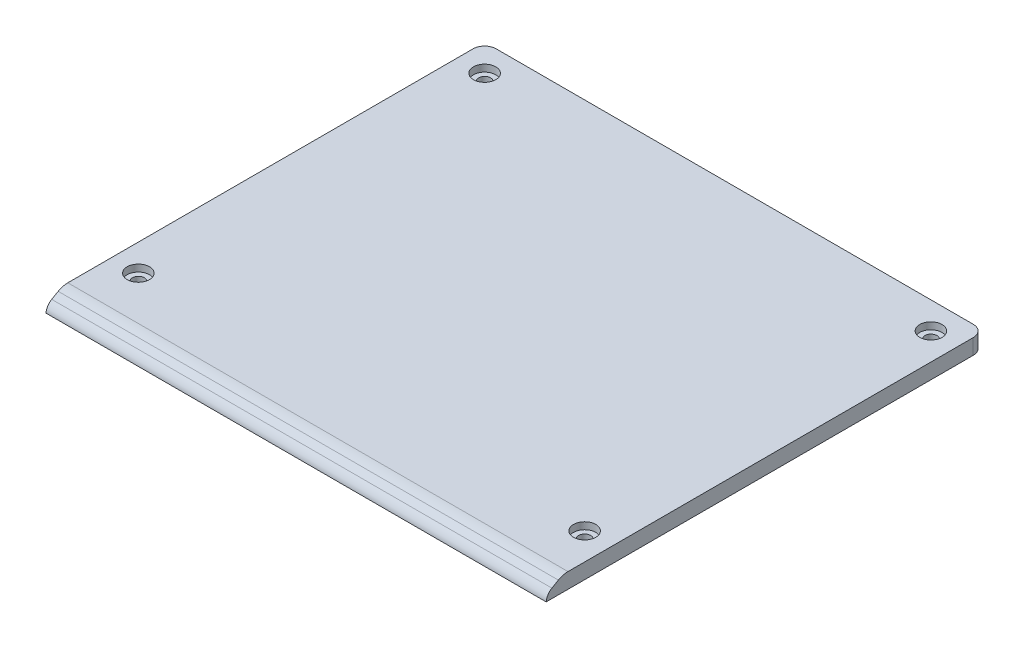
ISO-10303-21;
HEADER;
FILE_DESCRIPTION(('STEP AP214'),'2;1');
FILE_NAME('part.step','',(''),(''),'','','');
FILE_SCHEMA(('AUTOMOTIVE_DESIGN { 1 0 10303 214 1 1 1 1 }'));
ENDSEC;
DATA;
#1=APPLICATION_CONTEXT('core data for automotive mechanical design processes');
#2=APPLICATION_PROTOCOL_DEFINITION('international standard','automotive_design',2000,#1);
#3=PRODUCT_CONTEXT('',#1,'mechanical');
#4=PRODUCT('Part','Part','',(#3));
#5=PRODUCT_RELATED_PRODUCT_CATEGORY('part','',(#4));
#6=PRODUCT_DEFINITION_FORMATION('','',#4);
#7=PRODUCT_DEFINITION_CONTEXT('part definition',#1,'design');
#8=PRODUCT_DEFINITION('design','',#6,#7);
#9=PRODUCT_DEFINITION_SHAPE('','',#8);
#10=(LENGTH_UNIT() NAMED_UNIT(*) SI_UNIT(.MILLI.,.METRE.));
#11=(NAMED_UNIT(*) PLANE_ANGLE_UNIT() SI_UNIT($,.RADIAN.));
#12=(NAMED_UNIT(*) SI_UNIT($,.STERADIAN.) SOLID_ANGLE_UNIT());
#13=UNCERTAINTY_MEASURE_WITH_UNIT(LENGTH_MEASURE(1.E-05),#10,'distance_accuracy_value','');
#14=(GEOMETRIC_REPRESENTATION_CONTEXT(3) GLOBAL_UNCERTAINTY_ASSIGNED_CONTEXT((#13)) GLOBAL_UNIT_ASSIGNED_CONTEXT((#10,
#11,#12)) REPRESENTATION_CONTEXT('',''));
#15=CARTESIAN_POINT('',(0.,0.,0.));
#16=DIRECTION('',(0.,0.,1.));
#17=DIRECTION('',(1.,0.,0.));
#18=AXIS2_PLACEMENT_3D('',#15,#16,#17);
#19=CARTESIAN_POINT('',(58.,0.,40.));
#20=DIRECTION('',(0.,1.,0.));
#21=DIRECTION('',(0.,0.,1.));
#22=AXIS2_PLACEMENT_3D('',#19,#20,#21);
#23=CYLINDRICAL_SURFACE('',#22,1.55);
#24=CARTESIAN_POINT('',(58.,0.,40.));
#25=DIRECTION('',(0.,1.,0.));
#26=DIRECTION('',(0.,0.,1.));
#27=AXIS2_PLACEMENT_3D('',#24,#25,#26);
#28=CIRCLE('',#27,1.55);
#29=CARTESIAN_POINT('',(58.,0.,41.55));
#30=VERTEX_POINT('',#29);
#31=EDGE_CURVE('E11',#30,#30,#28,.T.);
#32=ORIENTED_EDGE('',*,*,#31,.F.);
#33=EDGE_LOOP('',(#32));
#34=FACE_BOUND('',#33,.T.);
#35=CARTESIAN_POINT('',(58.,2.2,40.));
#36=DIRECTION('',(0.,1.,0.));
#37=DIRECTION('',(0.,0.,1.));
#38=AXIS2_PLACEMENT_3D('',#35,#36,#37);
#39=CIRCLE('',#38,1.55);
#40=CARTESIAN_POINT('',(58.,2.2,41.55));
#41=VERTEX_POINT('',#40);
#42=EDGE_CURVE('E45',#41,#41,#39,.F.);
#43=ORIENTED_EDGE('',*,*,#42,.F.);
#44=EDGE_LOOP('',(#43));
#45=FACE_BOUND('',#44,.T.);
#46=ADVANCED_FACE('F42',(#34,#45),#23,.F.);
#47=CARTESIAN_POINT('',(-58.,0.,40.));
#48=DIRECTION('',(0.,1.,0.));
#49=DIRECTION('',(0.,0.,1.));
#50=AXIS2_PLACEMENT_3D('',#47,#48,#49);
#51=CYLINDRICAL_SURFACE('',#50,1.55);
#52=CARTESIAN_POINT('',(-58.,0.,40.));
#53=DIRECTION('',(0.,1.,0.));
#54=DIRECTION('',(0.,0.,1.));
#55=AXIS2_PLACEMENT_3D('',#52,#53,#54);
#56=CIRCLE('',#55,1.55);
#57=CARTESIAN_POINT('',(-58.,0.,41.55));
#58=VERTEX_POINT('',#57);
#59=EDGE_CURVE('E51',#58,#58,#56,.T.);
#60=ORIENTED_EDGE('',*,*,#59,.F.);
#61=EDGE_LOOP('',(#60));
#62=FACE_BOUND('',#61,.T.);
#63=CARTESIAN_POINT('',(-58.,2.2,40.));
#64=DIRECTION('',(0.,1.,0.));
#65=DIRECTION('',(0.,0.,1.));
#66=AXIS2_PLACEMENT_3D('',#63,#64,#65);
#67=CIRCLE('',#66,1.55);
#68=CARTESIAN_POINT('',(-58.,2.2,41.55));
#69=VERTEX_POINT('',#68);
#70=EDGE_CURVE('E209',#69,#69,#67,.F.);
#71=ORIENTED_EDGE('',*,*,#70,.F.);
#72=EDGE_LOOP('',(#71));
#73=FACE_BOUND('',#72,.T.);
#74=ADVANCED_FACE('F272',(#62,#73),#51,.F.);
#75=CARTESIAN_POINT('',(58.,0.,-50.));
#76=DIRECTION('',(0.,1.,0.));
#77=DIRECTION('',(0.,0.,1.));
#78=AXIS2_PLACEMENT_3D('',#75,#76,#77);
#79=CYLINDRICAL_SURFACE('',#78,1.55);
#80=CARTESIAN_POINT('',(58.,0.,-50.));
#81=DIRECTION('',(0.,1.,0.));
#82=DIRECTION('',(0.,0.,1.));
#83=AXIS2_PLACEMENT_3D('',#80,#81,#82);
#84=CIRCLE('',#83,1.55);
#85=CARTESIAN_POINT('',(58.,0.,-48.45));
#86=VERTEX_POINT('',#85);
#87=EDGE_CURVE('E204',#86,#86,#84,.T.);
#88=ORIENTED_EDGE('',*,*,#87,.F.);
#89=EDGE_LOOP('',(#88));
#90=FACE_BOUND('',#89,.T.);
#91=CARTESIAN_POINT('',(58.,2.2,-50.));
#92=DIRECTION('',(0.,1.,0.));
#93=DIRECTION('',(0.,0.,1.));
#94=AXIS2_PLACEMENT_3D('',#91,#92,#93);
#95=CIRCLE('',#94,1.55);
#96=CARTESIAN_POINT('',(58.,2.2,-48.45));
#97=VERTEX_POINT('',#96);
#98=EDGE_CURVE('E206',#97,#97,#95,.F.);
#99=ORIENTED_EDGE('',*,*,#98,.F.);
#100=EDGE_LOOP('',(#99));
#101=FACE_BOUND('',#100,.T.);
#102=ADVANCED_FACE('F277',(#90,#101),#79,.F.);
#103=CARTESIAN_POINT('',(-58.,0.,-50.));
#104=DIRECTION('',(0.,1.,0.));
#105=DIRECTION('',(0.,0.,1.));
#106=AXIS2_PLACEMENT_3D('',#103,#104,#105);
#107=CYLINDRICAL_SURFACE('',#106,1.55);
#108=CARTESIAN_POINT('',(-58.,0.,-50.));
#109=DIRECTION('',(0.,1.,0.));
#110=DIRECTION('',(0.,0.,1.));
#111=AXIS2_PLACEMENT_3D('',#108,#109,#110);
#112=CIRCLE('',#111,1.55);
#113=CARTESIAN_POINT('',(-58.,0.,-48.45));
#114=VERTEX_POINT('',#113);
#115=EDGE_CURVE('E233',#114,#114,#112,.T.);
#116=ORIENTED_EDGE('',*,*,#115,.F.);
#117=EDGE_LOOP('',(#116));
#118=FACE_BOUND('',#117,.T.);
#119=CARTESIAN_POINT('',(-58.,2.2,-50.));
#120=DIRECTION('',(0.,1.,0.));
#121=DIRECTION('',(0.,0.,1.));
#122=AXIS2_PLACEMENT_3D('',#119,#120,#121);
#123=CIRCLE('',#122,1.55);
#124=CARTESIAN_POINT('',(-58.,2.2,-48.45));
#125=VERTEX_POINT('',#124);
#126=EDGE_CURVE('E200',#125,#125,#123,.F.);
#127=ORIENTED_EDGE('',*,*,#126,.F.);
#128=EDGE_LOOP('',(#127));
#129=FACE_BOUND('',#128,.T.);
#130=ADVANCED_FACE('F285',(#118,#129),#107,.F.);
#131=CARTESIAN_POINT('',(65.,4.,-57.));
#132=DIRECTION('',(-1.,0.,0.));
#133=DIRECTION('',(0.,0.,1.));
#134=AXIS2_PLACEMENT_3D('',#131,#132,#133);
#135=PLANE('',#134);
#136=DIRECTION('',(0.,0.,-1.));
#137=VECTOR('',#136,1.);
#138=CARTESIAN_POINT('',(65.,0.,-57.));
#139=LINE('',#138,#137);
#140=CARTESIAN_POINT('',(65.,0.,57.));
#141=VERTEX_POINT('',#140);
#142=CARTESIAN_POINT('',(65.,0.,-54.));
#143=VERTEX_POINT('',#142);
#144=EDGE_CURVE('E139',#141,#143,#139,.T.);
#145=ORIENTED_EDGE('',*,*,#144,.T.);
#146=DIRECTION('',(0.,-1.,0.));
#147=VECTOR('',#146,1.);
#148=CARTESIAN_POINT('',(65.,4.,-54.));
#149=LINE('',#148,#147);
#150=CARTESIAN_POINT('',(65.,4.,-54.));
#151=VERTEX_POINT('',#150);
#152=EDGE_CURVE('E59',#143,#151,#149,.F.);
#153=ORIENTED_EDGE('',*,*,#152,.T.);
#154=DIRECTION('',(0.,0.,-1.));
#155=VECTOR('',#154,1.);
#156=CARTESIAN_POINT('',(65.,4.,-57.));
#157=LINE('',#156,#155);
#158=CARTESIAN_POINT('',(65.,4.,51.3301270189221));
#159=VERTEX_POINT('',#158);
#160=EDGE_CURVE('E141',#159,#151,#157,.T.);
#161=ORIENTED_EDGE('',*,*,#160,.F.);
#162=CARTESIAN_POINT('',(65.,-1.,51.3301270189222));
#163=DIRECTION('',(-1.,0.,0.));
#164=DIRECTION('',(0.,0.,1.));
#165=AXIS2_PLACEMENT_3D('',#162,#163,#164);
#166=CIRCLE('',#165,5.);
#167=CARTESIAN_POINT('',(65.,3.3301270189222,53.8301270189222));
#168=VERTEX_POINT('',#167);
#169=EDGE_CURVE('E160',#159,#168,#166,.F.);
#170=ORIENTED_EDGE('',*,*,#169,.T.);
#171=DIRECTION('',(0.,-0.499999999999999,0.866025403784439));
#172=VECTOR('',#171,1.);
#173=CARTESIAN_POINT('',(65.,4.00000000000001,52.6698729810778));
#174=LINE('',#173,#172);
#175=CARTESIAN_POINT('',(65.,2.36058980188207,55.5094147386646));
#176=VERTEX_POINT('',#175);
#177=EDGE_CURVE('E148',#168,#176,#174,.T.);
#178=ORIENTED_EDGE('',*,*,#177,.T.);
#179=CARTESIAN_POINT('',(65.,-0.237486409471245,54.0094147386646));
#180=DIRECTION('',(-1.,0.,0.));
#181=DIRECTION('',(0.,0.,1.));
#182=AXIS2_PLACEMENT_3D('',#179,#180,#181);
#183=CIRCLE('',#182,3.);
#184=EDGE_CURVE('E172',#176,#141,#183,.F.);
#185=ORIENTED_EDGE('',*,*,#184,.T.);
#186=EDGE_LOOP('',(#145,#153,#161,#170,#178,#185));
#187=FACE_BOUND('',#186,.T.);
#188=ADVANCED_FACE('F257',(#187),#135,.F.);
#189=CARTESIAN_POINT('',(-65.,4.,-57.));
#190=DIRECTION('',(0.,0.,1.));
#191=DIRECTION('',(1.,0.,0.));
#192=AXIS2_PLACEMENT_3D('',#189,#190,#191);
#193=PLANE('',#192);
#194=DIRECTION('',(-1.,0.,0.));
#195=VECTOR('',#194,1.);
#196=CARTESIAN_POINT('',(-65.,0.,-57.));
#197=LINE('',#196,#195);
#198=CARTESIAN_POINT('',(62.,0.,-57.));
#199=VERTEX_POINT('',#198);
#200=CARTESIAN_POINT('',(-62.,0.,-57.));
#201=VERTEX_POINT('',#200);
#202=EDGE_CURVE('E125',#199,#201,#197,.T.);
#203=ORIENTED_EDGE('',*,*,#202,.T.);
#204=DIRECTION('',(0.,-1.,0.));
#205=VECTOR('',#204,1.);
#206=CARTESIAN_POINT('',(-62.,4.,-57.));
#207=LINE('',#206,#205);
#208=CARTESIAN_POINT('',(-62.,4.,-57.));
#209=VERTEX_POINT('',#208);
#210=EDGE_CURVE('E67',#201,#209,#207,.F.);
#211=ORIENTED_EDGE('',*,*,#210,.T.);
#212=DIRECTION('',(-1.,0.,0.));
#213=VECTOR('',#212,1.);
#214=CARTESIAN_POINT('',(-65.,4.,-57.));
#215=LINE('',#214,#213);
#216=CARTESIAN_POINT('',(62.,4.,-57.));
#217=VERTEX_POINT('',#216);
#218=EDGE_CURVE('E144',#217,#209,#215,.T.);
#219=ORIENTED_EDGE('',*,*,#218,.F.);
#220=DIRECTION('',(0.,-1.,0.));
#221=VECTOR('',#220,1.);
#222=CARTESIAN_POINT('',(62.,4.,-57.));
#223=LINE('',#222,#221);
#224=EDGE_CURVE('E183',#217,#199,#223,.T.);
#225=ORIENTED_EDGE('',*,*,#224,.T.);
#226=EDGE_LOOP('',(#203,#211,#219,#225));
#227=FACE_BOUND('',#226,.T.);
#228=ADVANCED_FACE('F244',(#227),#193,.F.);
#229=CARTESIAN_POINT('',(-65.,4.,-57.));
#230=DIRECTION('',(1.,0.,0.));
#231=DIRECTION('',(0.,0.,-1.));
#232=AXIS2_PLACEMENT_3D('',#229,#230,#231);
#233=PLANE('',#232);
#234=DIRECTION('',(0.,0.,1.));
#235=VECTOR('',#234,1.);
#236=CARTESIAN_POINT('',(-65.,4.,-57.));
#237=LINE('',#236,#235);
#238=CARTESIAN_POINT('',(-65.,4.,-54.));
#239=VERTEX_POINT('',#238);
#240=CARTESIAN_POINT('',(-65.,4.,51.3301270189221));
#241=VERTEX_POINT('',#240);
#242=EDGE_CURVE('E153',#239,#241,#237,.T.);
#243=ORIENTED_EDGE('',*,*,#242,.F.);
#244=DIRECTION('',(0.,-1.,0.));
#245=VECTOR('',#244,1.);
#246=CARTESIAN_POINT('',(-65.,4.,-54.));
#247=LINE('',#246,#245);
#248=CARTESIAN_POINT('',(-65.,0.,-54.));
#249=VERTEX_POINT('',#248);
#250=EDGE_CURVE('E120',#239,#249,#247,.T.);
#251=ORIENTED_EDGE('',*,*,#250,.T.);
#252=DIRECTION('',(0.,0.,1.));
#253=VECTOR('',#252,1.);
#254=CARTESIAN_POINT('',(-65.,0.,-57.));
#255=LINE('',#254,#253);
#256=CARTESIAN_POINT('',(-65.,0.,57.));
#257=VERTEX_POINT('',#256);
#258=EDGE_CURVE('E113',#249,#257,#255,.T.);
#259=ORIENTED_EDGE('',*,*,#258,.T.);
#260=CARTESIAN_POINT('',(-65.,-0.237486409471245,54.0094147386646));
#261=DIRECTION('',(1.,0.,0.));
#262=DIRECTION('',(0.,0.,-1.));
#263=AXIS2_PLACEMENT_3D('',#260,#261,#262);
#264=CIRCLE('',#263,3.);
#265=CARTESIAN_POINT('',(-65.,2.36058980188207,55.5094147386646));
#266=VERTEX_POINT('',#265);
#267=EDGE_CURVE('E117',#257,#266,#264,.F.);
#268=ORIENTED_EDGE('',*,*,#267,.T.);
#269=DIRECTION('',(0.,0.499999999999999,-0.866025403784439));
#270=VECTOR('',#269,1.);
#271=CARTESIAN_POINT('',(-65.,4.,52.6698729810778));
#272=LINE('',#271,#270);
#273=CARTESIAN_POINT('',(-65.,3.3301270189222,53.8301270189222));
#274=VERTEX_POINT('',#273);
#275=EDGE_CURVE('E152',#266,#274,#272,.T.);
#276=ORIENTED_EDGE('',*,*,#275,.T.);
#277=CARTESIAN_POINT('',(-65.,-1.,51.3301270189222));
#278=DIRECTION('',(1.,0.,0.));
#279=DIRECTION('',(0.,0.,-1.));
#280=AXIS2_PLACEMENT_3D('',#277,#278,#279);
#281=CIRCLE('',#280,5.);
#282=EDGE_CURVE('E134',#274,#241,#281,.F.);
#283=ORIENTED_EDGE('',*,*,#282,.T.);
#284=EDGE_LOOP('',(#243,#251,#259,#268,#276,#283));
#285=FACE_BOUND('',#284,.T.);
#286=ADVANCED_FACE('F116',(#285),#233,.F.);
#287=CARTESIAN_POINT('',(0.,4.,0.));
#288=DIRECTION('',(0.,1.,0.));
#289=DIRECTION('',(0.,0.,1.));
#290=AXIS2_PLACEMENT_3D('',#287,#288,#289);
#291=PLANE('',#290);
#292=CARTESIAN_POINT('',(-58.,4.,40.));
#293=DIRECTION('',(0.,1.,0.));
#294=DIRECTION('',(0.,0.,1.));
#295=AXIS2_PLACEMENT_3D('',#292,#293,#294);
#296=CIRCLE('',#295,2.9);
#297=CARTESIAN_POINT('',(-58.,4.,42.9));
#298=VERTEX_POINT('',#297);
#299=EDGE_CURVE('E471',#298,#298,#296,.T.);
#300=ORIENTED_EDGE('',*,*,#299,.F.);
#301=EDGE_LOOP('',(#300));
#302=FACE_BOUND('',#301,.T.);
#303=CARTESIAN_POINT('',(58.,4.,-50.));
#304=DIRECTION('',(0.,1.,0.));
#305=DIRECTION('',(0.,0.,1.));
#306=AXIS2_PLACEMENT_3D('',#303,#304,#305);
#307=CIRCLE('',#306,2.9);
#308=CARTESIAN_POINT('',(58.,4.,-47.1));
#309=VERTEX_POINT('',#308);
#310=EDGE_CURVE('E475',#309,#309,#307,.T.);
#311=ORIENTED_EDGE('',*,*,#310,.F.);
#312=EDGE_LOOP('',(#311));
#313=FACE_BOUND('',#312,.T.);
#314=CARTESIAN_POINT('',(58.,4.,40.));
#315=DIRECTION('',(0.,1.,0.));
#316=DIRECTION('',(0.,0.,1.));
#317=AXIS2_PLACEMENT_3D('',#314,#315,#316);
#318=CIRCLE('',#317,2.9);
#319=CARTESIAN_POINT('',(58.,4.,42.9));
#320=VERTEX_POINT('',#319);
#321=EDGE_CURVE('E479',#320,#320,#318,.T.);
#322=ORIENTED_EDGE('',*,*,#321,.F.);
#323=EDGE_LOOP('',(#322));
#324=FACE_BOUND('',#323,.T.);
#325=CARTESIAN_POINT('',(-58.,4.,-50.));
#326=DIRECTION('',(0.,1.,0.));
#327=DIRECTION('',(0.,0.,1.));
#328=AXIS2_PLACEMENT_3D('',#325,#326,#327);
#329=CIRCLE('',#328,2.9);
#330=CARTESIAN_POINT('',(-58.,4.,-47.1));
#331=VERTEX_POINT('',#330);
#332=EDGE_CURVE('E217',#331,#331,#329,.T.);
#333=ORIENTED_EDGE('',*,*,#332,.F.);
#334=EDGE_LOOP('',(#333));
#335=FACE_BOUND('',#334,.T.);
#336=ORIENTED_EDGE('',*,*,#218,.T.);
#337=CARTESIAN_POINT('',(-62.,4.,-54.));
#338=DIRECTION('',(0.,1.,0.));
#339=DIRECTION('',(0.,0.,1.));
#340=AXIS2_PLACEMENT_3D('',#337,#338,#339);
#341=CIRCLE('',#340,3.);
#342=EDGE_CURVE('E192',#209,#239,#341,.T.);
#343=ORIENTED_EDGE('',*,*,#342,.T.);
#344=ORIENTED_EDGE('',*,*,#242,.T.);
#345=DIRECTION('',(1.,0.,0.));
#346=VECTOR('',#345,1.);
#347=CARTESIAN_POINT('',(0.,4.,51.3301270189222));
#348=LINE('',#347,#346);
#349=EDGE_CURVE('E156',#241,#159,#348,.T.);
#350=ORIENTED_EDGE('',*,*,#349,.T.);
#351=ORIENTED_EDGE('',*,*,#160,.T.);
#352=CARTESIAN_POINT('',(62.,4.,-54.));
#353=DIRECTION('',(0.,1.,0.));
#354=DIRECTION('',(0.,0.,1.));
#355=AXIS2_PLACEMENT_3D('',#352,#353,#354);
#356=CIRCLE('',#355,3.);
#357=EDGE_CURVE('E189',#151,#217,#356,.T.);
#358=ORIENTED_EDGE('',*,*,#357,.T.);
#359=EDGE_LOOP('',(#336,#343,#344,#350,#351,#358));
#360=FACE_BOUND('',#359,.T.);
#361=ADVANCED_FACE('F250',(#302,#313,#324,#335,#360),#291,.T.);
#362=CARTESIAN_POINT('',(0.,0.,0.));
#363=DIRECTION('',(0.,1.,0.));
#364=DIRECTION('',(0.,0.,1.));
#365=AXIS2_PLACEMENT_3D('',#362,#363,#364);
#366=PLANE('',#365);
#367=ORIENTED_EDGE('',*,*,#87,.T.);
#368=EDGE_LOOP('',(#367));
#369=FACE_BOUND('',#368,.T.);
#370=ORIENTED_EDGE('',*,*,#115,.T.);
#371=EDGE_LOOP('',(#370));
#372=FACE_BOUND('',#371,.T.);
#373=ORIENTED_EDGE('',*,*,#258,.F.);
#374=CARTESIAN_POINT('',(-62.,0.,-54.));
#375=DIRECTION('',(0.,1.,0.));
#376=DIRECTION('',(0.,0.,1.));
#377=AXIS2_PLACEMENT_3D('',#374,#375,#376);
#378=CIRCLE('',#377,3.);
#379=EDGE_CURVE('E180',#249,#201,#378,.F.);
#380=ORIENTED_EDGE('',*,*,#379,.T.);
#381=ORIENTED_EDGE('',*,*,#202,.F.);
#382=CARTESIAN_POINT('',(62.,0.,-54.));
#383=DIRECTION('',(0.,1.,0.));
#384=DIRECTION('',(0.,0.,1.));
#385=AXIS2_PLACEMENT_3D('',#382,#383,#384);
#386=CIRCLE('',#385,3.);
#387=EDGE_CURVE('E177',#199,#143,#386,.F.);
#388=ORIENTED_EDGE('',*,*,#387,.T.);
#389=ORIENTED_EDGE('',*,*,#144,.F.);
#390=DIRECTION('',(1.,0.,0.));
#391=VECTOR('',#390,1.);
#392=CARTESIAN_POINT('',(-65.,0.,57.));
#393=LINE('',#392,#391);
#394=EDGE_CURVE('E124',#257,#141,#393,.T.);
#395=ORIENTED_EDGE('',*,*,#394,.F.);
#396=EDGE_LOOP('',(#373,#380,#381,#388,#389,#395));
#397=FACE_BOUND('',#396,.T.);
#398=ORIENTED_EDGE('',*,*,#59,.T.);
#399=EDGE_LOOP('',(#398));
#400=FACE_BOUND('',#399,.T.);
#401=ORIENTED_EDGE('',*,*,#31,.T.);
#402=EDGE_LOOP('',(#401));
#403=FACE_BOUND('',#402,.T.);
#404=ADVANCED_FACE('F137',(#369,#372,#397,#400,#403),#366,.F.);
#405=CARTESIAN_POINT('',(0.,4.,52.6698729810778));
#406=DIRECTION('',(0.,0.866025403784439,0.499999999999999));
#407=DIRECTION('',(-1.,0.,0.));
#408=AXIS2_PLACEMENT_3D('',#405,#406,#407);
#409=PLANE('',#408);
#410=ORIENTED_EDGE('',*,*,#275,.F.);
#411=DIRECTION('',(-1.,0.,0.));
#412=VECTOR('',#411,1.);
#413=CARTESIAN_POINT('',(65.,2.36058980188207,55.5094147386646));
#414=LINE('',#413,#412);
#415=EDGE_CURVE('E132',#266,#176,#414,.F.);
#416=ORIENTED_EDGE('',*,*,#415,.T.);
#417=ORIENTED_EDGE('',*,*,#177,.F.);
#418=DIRECTION('',(1.,0.,0.));
#419=VECTOR('',#418,1.);
#420=CARTESIAN_POINT('',(0.,3.3301270189222,53.8301270189222));
#421=LINE('',#420,#419);
#422=EDGE_CURVE('E163',#168,#274,#421,.F.);
#423=ORIENTED_EDGE('',*,*,#422,.T.);
#424=EDGE_LOOP('',(#410,#416,#417,#423));
#425=FACE_BOUND('',#424,.T.);
#426=ADVANCED_FACE('F260',(#425),#409,.T.);
#427=CARTESIAN_POINT('',(0.,-1.,51.3301270189222));
#428=DIRECTION('',(1.,0.,0.));
#429=DIRECTION('',(0.,0.,-1.));
#430=AXIS2_PLACEMENT_3D('',#427,#428,#429);
#431=CYLINDRICAL_SURFACE('',#430,5.);
#432=ORIENTED_EDGE('',*,*,#282,.F.);
#433=ORIENTED_EDGE('',*,*,#422,.F.);
#434=ORIENTED_EDGE('',*,*,#169,.F.);
#435=ORIENTED_EDGE('',*,*,#349,.F.);
#436=EDGE_LOOP('',(#432,#433,#434,#435));
#437=FACE_BOUND('',#436,.T.);
#438=ADVANCED_FACE('F255',(#437),#431,.T.);
#439=CARTESIAN_POINT('',(-65.,-0.237486409471245,54.0094147386646));
#440=DIRECTION('',(1.,0.,0.));
#441=DIRECTION('',(0.,0.,-1.));
#442=AXIS2_PLACEMENT_3D('',#439,#440,#441);
#443=CYLINDRICAL_SURFACE('',#442,3.);
#444=ORIENTED_EDGE('',*,*,#184,.F.);
#445=ORIENTED_EDGE('',*,*,#415,.F.);
#446=ORIENTED_EDGE('',*,*,#267,.F.);
#447=ORIENTED_EDGE('',*,*,#394,.T.);
#448=EDGE_LOOP('',(#444,#445,#446,#447));
#449=FACE_BOUND('',#448,.T.);
#450=ADVANCED_FACE('F131',(#449),#443,.T.);
#451=CARTESIAN_POINT('',(-62.,4.,-54.));
#452=DIRECTION('',(0.,-1.,0.));
#453=DIRECTION('',(0.,0.,-1.));
#454=AXIS2_PLACEMENT_3D('',#451,#452,#453);
#455=CYLINDRICAL_SURFACE('',#454,3.);
#456=ORIENTED_EDGE('',*,*,#342,.F.);
#457=ORIENTED_EDGE('',*,*,#210,.F.);
#458=ORIENTED_EDGE('',*,*,#379,.F.);
#459=ORIENTED_EDGE('',*,*,#250,.F.);
#460=EDGE_LOOP('',(#456,#457,#458,#459));
#461=FACE_BOUND('',#460,.T.);
#462=ADVANCED_FACE('F248',(#461),#455,.T.);
#463=CARTESIAN_POINT('',(62.,4.,-54.));
#464=DIRECTION('',(0.,-1.,0.));
#465=DIRECTION('',(0.,0.,-1.));
#466=AXIS2_PLACEMENT_3D('',#463,#464,#465);
#467=CYLINDRICAL_SURFACE('',#466,3.);
#468=ORIENTED_EDGE('',*,*,#357,.F.);
#469=ORIENTED_EDGE('',*,*,#152,.F.);
#470=ORIENTED_EDGE('',*,*,#387,.F.);
#471=ORIENTED_EDGE('',*,*,#224,.F.);
#472=EDGE_LOOP('',(#468,#469,#470,#471));
#473=FACE_BOUND('',#472,.T.);
#474=ADVANCED_FACE('F291',(#473),#467,.T.);
#475=CARTESIAN_POINT('',(-58.,2.2,-50.));
#476=DIRECTION('',(0.,1.,0.));
#477=DIRECTION('',(0.,0.,1.));
#478=AXIS2_PLACEMENT_3D('',#475,#476,#477);
#479=PLANE('',#478);
#480=CARTESIAN_POINT('',(-58.,2.2,-50.));
#481=DIRECTION('',(0.,1.,0.));
#482=DIRECTION('',(0.,0.,1.));
#483=AXIS2_PLACEMENT_3D('',#480,#481,#482);
#484=CIRCLE('',#483,2.9);
#485=CARTESIAN_POINT('',(-58.,2.2,-47.1));
#486=VERTEX_POINT('',#485);
#487=EDGE_CURVE('E205',#486,#486,#484,.T.);
#488=ORIENTED_EDGE('',*,*,#487,.T.);
#489=EDGE_LOOP('',(#488));
#490=FACE_BOUND('',#489,.T.);
#491=ORIENTED_EDGE('',*,*,#126,.T.);
#492=EDGE_LOOP('',(#491));
#493=FACE_BOUND('',#492,.T.);
#494=ADVANCED_FACE('F294',(#490,#493),#479,.T.);
#495=CARTESIAN_POINT('',(-58.,2.2,-50.));
#496=DIRECTION('',(0.,1.,0.));
#497=DIRECTION('',(0.,0.,1.));
#498=AXIS2_PLACEMENT_3D('',#495,#496,#497);
#499=CYLINDRICAL_SURFACE('',#498,2.9);
#500=ORIENTED_EDGE('',*,*,#487,.F.);
#501=EDGE_LOOP('',(#500));
#502=FACE_BOUND('',#501,.T.);
#503=ORIENTED_EDGE('',*,*,#332,.T.);
#504=EDGE_LOOP('',(#503));
#505=FACE_BOUND('',#504,.T.);
#506=ADVANCED_FACE('F320',(#502,#505),#499,.F.);
#507=CARTESIAN_POINT('',(58.,2.2,-50.));
#508=DIRECTION('',(0.,1.,0.));
#509=DIRECTION('',(0.,0.,1.));
#510=AXIS2_PLACEMENT_3D('',#507,#508,#509);
#511=PLANE('',#510);
#512=CARTESIAN_POINT('',(58.,2.2,-50.));
#513=DIRECTION('',(0.,1.,0.));
#514=DIRECTION('',(0.,0.,1.));
#515=AXIS2_PLACEMENT_3D('',#512,#513,#514);
#516=CIRCLE('',#515,2.9);
#517=CARTESIAN_POINT('',(58.,2.2,-47.1));
#518=VERTEX_POINT('',#517);
#519=EDGE_CURVE('E489',#518,#518,#516,.T.);
#520=ORIENTED_EDGE('',*,*,#519,.T.);
#521=EDGE_LOOP('',(#520));
#522=FACE_BOUND('',#521,.T.);
#523=ORIENTED_EDGE('',*,*,#98,.T.);
#524=EDGE_LOOP('',(#523));
#525=FACE_BOUND('',#524,.T.);
#526=ADVANCED_FACE('F329',(#522,#525),#511,.T.);
#527=CARTESIAN_POINT('',(58.,2.2,-50.));
#528=DIRECTION('',(0.,1.,0.));
#529=DIRECTION('',(0.,0.,1.));
#530=AXIS2_PLACEMENT_3D('',#527,#528,#529);
#531=CYLINDRICAL_SURFACE('',#530,2.9);
#532=ORIENTED_EDGE('',*,*,#519,.F.);
#533=EDGE_LOOP('',(#532));
#534=FACE_BOUND('',#533,.T.);
#535=ORIENTED_EDGE('',*,*,#310,.T.);
#536=EDGE_LOOP('',(#535));
#537=FACE_BOUND('',#536,.T.);
#538=ADVANCED_FACE('F337',(#534,#537),#531,.F.);
#539=CARTESIAN_POINT('',(58.,2.2,40.));
#540=DIRECTION('',(0.,1.,0.));
#541=DIRECTION('',(0.,0.,1.));
#542=AXIS2_PLACEMENT_3D('',#539,#540,#541);
#543=PLANE('',#542);
#544=CARTESIAN_POINT('',(58.,2.2,40.));
#545=DIRECTION('',(0.,1.,0.));
#546=DIRECTION('',(0.,0.,1.));
#547=AXIS2_PLACEMENT_3D('',#544,#545,#546);
#548=CIRCLE('',#547,2.9);
#549=CARTESIAN_POINT('',(58.,2.2,42.9));
#550=VERTEX_POINT('',#549);
#551=EDGE_CURVE('E482',#550,#550,#548,.T.);
#552=ORIENTED_EDGE('',*,*,#551,.T.);
#553=EDGE_LOOP('',(#552));
#554=FACE_BOUND('',#553,.T.);
#555=ORIENTED_EDGE('',*,*,#42,.T.);
#556=EDGE_LOOP('',(#555));
#557=FACE_BOUND('',#556,.T.);
#558=ADVANCED_FACE('F346',(#554,#557),#543,.T.);
#559=CARTESIAN_POINT('',(58.,2.2,40.));
#560=DIRECTION('',(0.,1.,0.));
#561=DIRECTION('',(0.,0.,1.));
#562=AXIS2_PLACEMENT_3D('',#559,#560,#561);
#563=CYLINDRICAL_SURFACE('',#562,2.9);
#564=ORIENTED_EDGE('',*,*,#551,.F.);
#565=EDGE_LOOP('',(#564));
#566=FACE_BOUND('',#565,.T.);
#567=ORIENTED_EDGE('',*,*,#321,.T.);
#568=EDGE_LOOP('',(#567));
#569=FACE_BOUND('',#568,.T.);
#570=ADVANCED_FACE('F354',(#566,#569),#563,.F.);
#571=CARTESIAN_POINT('',(-58.,2.2,40.));
#572=DIRECTION('',(0.,1.,0.));
#573=DIRECTION('',(0.,0.,1.));
#574=AXIS2_PLACEMENT_3D('',#571,#572,#573);
#575=PLANE('',#574);
#576=CARTESIAN_POINT('',(-58.,2.2,40.));
#577=DIRECTION('',(0.,1.,0.));
#578=DIRECTION('',(0.,0.,1.));
#579=AXIS2_PLACEMENT_3D('',#576,#577,#578);
#580=CIRCLE('',#579,2.9);
#581=CARTESIAN_POINT('',(-58.,2.2,42.9));
#582=VERTEX_POINT('',#581);
#583=EDGE_CURVE('E210',#582,#582,#580,.T.);
#584=ORIENTED_EDGE('',*,*,#583,.T.);
#585=EDGE_LOOP('',(#584));
#586=FACE_BOUND('',#585,.T.);
#587=ORIENTED_EDGE('',*,*,#70,.T.);
#588=EDGE_LOOP('',(#587));
#589=FACE_BOUND('',#588,.T.);
#590=ADVANCED_FACE('F362',(#586,#589),#575,.T.);
#591=CARTESIAN_POINT('',(-58.,2.2,40.));
#592=DIRECTION('',(0.,1.,0.));
#593=DIRECTION('',(0.,0.,1.));
#594=AXIS2_PLACEMENT_3D('',#591,#592,#593);
#595=CYLINDRICAL_SURFACE('',#594,2.9);
#596=ORIENTED_EDGE('',*,*,#583,.F.);
#597=EDGE_LOOP('',(#596));
#598=FACE_BOUND('',#597,.T.);
#599=ORIENTED_EDGE('',*,*,#299,.T.);
#600=EDGE_LOOP('',(#599));
#601=FACE_BOUND('',#600,.T.);
#602=ADVANCED_FACE('F370',(#598,#601),#595,.F.);
#603=CLOSED_SHELL('',(#46,#74,#102,#130,#188,#228,#286,#361,#404,#426,#438,#450,#462,#474,#494,
#506,#526,#538,#558,#570,#590,#602));
#604=MANIFOLD_SOLID_BREP('B2',#603);
#605=ADVANCED_BREP_SHAPE_REPRESENTATION('',(#18,#604),#14);
#606=SHAPE_DEFINITION_REPRESENTATION(#9,#605);
ENDSEC;
END-ISO-10303-21;
